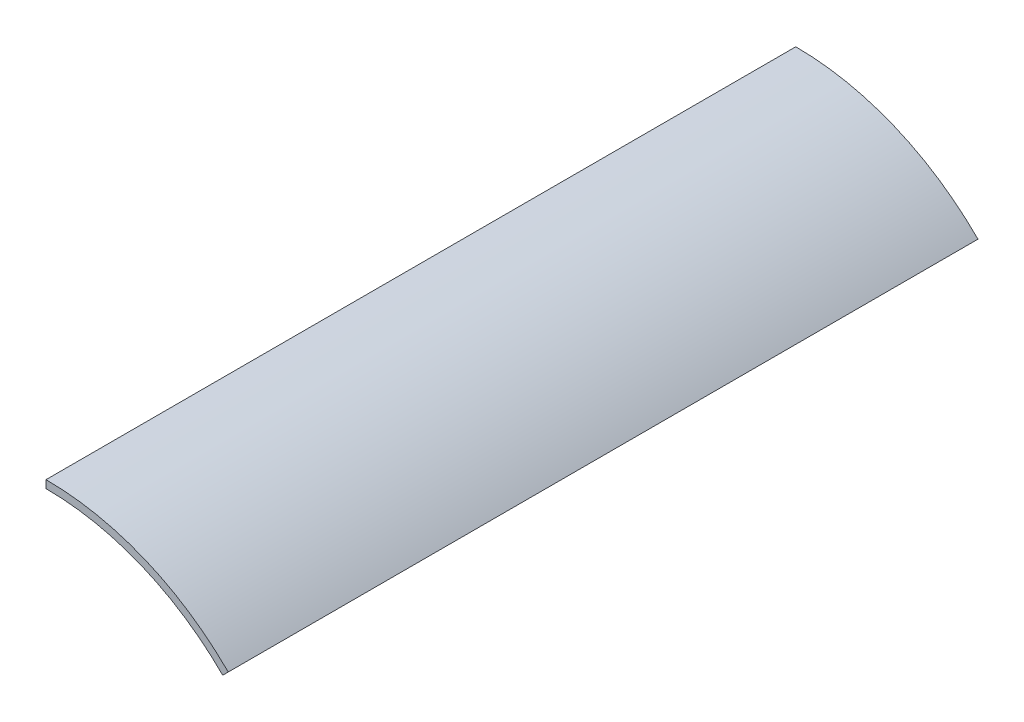
ISO-10303-21;
HEADER;
FILE_DESCRIPTION(('STEP AP214'),'2;1');
FILE_NAME('part.step','',(''),(''),'','','');
FILE_SCHEMA(('AUTOMOTIVE_DESIGN { 1 0 10303 214 1 1 1 1 }'));
ENDSEC;
DATA;
#1=APPLICATION_CONTEXT('core data for automotive mechanical design processes');
#2=APPLICATION_PROTOCOL_DEFINITION('international standard','automotive_design',2000,#1);
#3=PRODUCT_CONTEXT('',#1,'mechanical');
#4=PRODUCT('Part','Part','',(#3));
#5=PRODUCT_RELATED_PRODUCT_CATEGORY('part','',(#4));
#6=PRODUCT_DEFINITION_FORMATION('','',#4);
#7=PRODUCT_DEFINITION_CONTEXT('part definition',#1,'design');
#8=PRODUCT_DEFINITION('design','',#6,#7);
#9=PRODUCT_DEFINITION_SHAPE('','',#8);
#10=(LENGTH_UNIT() NAMED_UNIT(*) SI_UNIT(.MILLI.,.METRE.));
#11=(NAMED_UNIT(*) PLANE_ANGLE_UNIT() SI_UNIT($,.RADIAN.));
#12=(NAMED_UNIT(*) SI_UNIT($,.STERADIAN.) SOLID_ANGLE_UNIT());
#13=UNCERTAINTY_MEASURE_WITH_UNIT(LENGTH_MEASURE(1.E-05),#10,'distance_accuracy_value','');
#14=(GEOMETRIC_REPRESENTATION_CONTEXT(3) GLOBAL_UNCERTAINTY_ASSIGNED_CONTEXT((#13)) GLOBAL_UNIT_ASSIGNED_CONTEXT((#10,
#11,#12)) REPRESENTATION_CONTEXT('',''));
#15=CARTESIAN_POINT('',(0.,0.,0.));
#16=DIRECTION('',(0.,0.,1.));
#17=DIRECTION('',(1.,0.,0.));
#18=AXIS2_PLACEMENT_3D('',#15,#16,#17);
#19=CARTESIAN_POINT('',(0.,0.,-152.4));
#20=DIRECTION('',(0.,0.,1.));
#21=DIRECTION('',(1.,0.,0.));
#22=AXIS2_PLACEMENT_3D('',#19,#20,#21);
#23=CYLINDRICAL_SURFACE('',#22,101.6);
#24=DIRECTION('',(0.,0.,1.));
#25=VECTOR('',#24,1.);
#26=CARTESIAN_POINT('',(71.8420489685534,71.8420489685531,-152.4));
#27=LINE('',#26,#25);
#28=CARTESIAN_POINT('',(71.8420489685534,71.8420489685531,-152.4));
#29=VERTEX_POINT('',#28);
#30=CARTESIAN_POINT('',(71.8420489685534,71.8420489685531,152.4));
#31=VERTEX_POINT('',#30);
#32=EDGE_CURVE('E36',#29,#31,#27,.T.);
#33=ORIENTED_EDGE('',*,*,#32,.T.);
#34=CARTESIAN_POINT('',(0.,0.,152.4));
#35=DIRECTION('',(0.,0.,-1.));
#36=DIRECTION('',(-1.,0.,0.));
#37=AXIS2_PLACEMENT_3D('',#34,#35,#36);
#38=CIRCLE('',#37,101.6);
#39=CARTESIAN_POINT('',(0.,101.6,152.4));
#40=VERTEX_POINT('',#39);
#41=EDGE_CURVE('E73',#40,#31,#38,.T.);
#42=ORIENTED_EDGE('',*,*,#41,.F.);
#43=DIRECTION('',(0.,0.,1.));
#44=VECTOR('',#43,1.);
#45=CARTESIAN_POINT('',(0.,101.6,-152.4));
#46=LINE('',#45,#44);
#47=CARTESIAN_POINT('',(0.,101.6,-152.4));
#48=VERTEX_POINT('',#47);
#49=EDGE_CURVE('E11',#48,#40,#46,.T.);
#50=ORIENTED_EDGE('',*,*,#49,.F.);
#51=CARTESIAN_POINT('',(0.,0.,-152.4));
#52=DIRECTION('',(0.,0.,-1.));
#53=DIRECTION('',(-1.,0.,0.));
#54=AXIS2_PLACEMENT_3D('',#51,#52,#53);
#55=CIRCLE('',#54,101.6);
#56=EDGE_CURVE('E74',#48,#29,#55,.T.);
#57=ORIENTED_EDGE('',*,*,#56,.T.);
#58=EDGE_LOOP('',(#33,#42,#50,#57));
#59=FACE_BOUND('',#58,.T.);
#60=ADVANCED_FACE('F33',(#59),#23,.F.);
#61=CARTESIAN_POINT('',(0.,104.775,-152.4));
#62=DIRECTION('',(-1.,0.,0.));
#63=DIRECTION('',(0.,-1.,0.));
#64=AXIS2_PLACEMENT_3D('',#61,#62,#63);
#65=PLANE('',#64);
#66=ORIENTED_EDGE('',*,*,#49,.T.);
#67=DIRECTION('',(0.,-1.,0.));
#68=VECTOR('',#67,1.);
#69=CARTESIAN_POINT('',(0.,104.775,152.4));
#70=LINE('',#69,#68);
#71=CARTESIAN_POINT('',(0.,104.775,152.4));
#72=VERTEX_POINT('',#71);
#73=EDGE_CURVE('E90',#72,#40,#70,.T.);
#74=ORIENTED_EDGE('',*,*,#73,.F.);
#75=DIRECTION('',(0.,0.,1.));
#76=VECTOR('',#75,1.);
#77=CARTESIAN_POINT('',(0.,104.775,-152.4));
#78=LINE('',#77,#76);
#79=CARTESIAN_POINT('',(0.,104.775,-152.4));
#80=VERTEX_POINT('',#79);
#81=EDGE_CURVE('E41',#80,#72,#78,.T.);
#82=ORIENTED_EDGE('',*,*,#81,.F.);
#83=DIRECTION('',(0.,-1.,0.));
#84=VECTOR('',#83,1.);
#85=CARTESIAN_POINT('',(0.,104.775,-152.4));
#86=LINE('',#85,#84);
#87=EDGE_CURVE('E79',#80,#48,#86,.T.);
#88=ORIENTED_EDGE('',*,*,#87,.T.);
#89=EDGE_LOOP('',(#66,#74,#82,#88));
#90=FACE_BOUND('',#89,.T.);
#91=ADVANCED_FACE('F105',(#90),#65,.T.);
#92=CARTESIAN_POINT('',(0.,0.,-152.4));
#93=DIRECTION('',(0.,0.,1.));
#94=DIRECTION('',(1.,0.,0.));
#95=AXIS2_PLACEMENT_3D('',#92,#93,#94);
#96=CYLINDRICAL_SURFACE('',#95,104.775);
#97=ORIENTED_EDGE('',*,*,#81,.T.);
#98=CARTESIAN_POINT('',(0.,0.,152.4));
#99=DIRECTION('',(0.,0.,1.));
#100=DIRECTION('',(-1.,0.,0.));
#101=AXIS2_PLACEMENT_3D('',#98,#99,#100);
#102=CIRCLE('',#101,104.775);
#103=CARTESIAN_POINT('',(74.0871129988206,74.0871129988204,152.4));
#104=VERTEX_POINT('',#103);
#105=EDGE_CURVE('E86',#104,#72,#102,.T.);
#106=ORIENTED_EDGE('',*,*,#105,.F.);
#107=DIRECTION('',(0.,0.,1.));
#108=VECTOR('',#107,1.);
#109=CARTESIAN_POINT('',(74.0871129988206,74.0871129988204,-152.4));
#110=LINE('',#109,#108);
#111=CARTESIAN_POINT('',(74.0871129988206,74.0871129988204,-152.4));
#112=VERTEX_POINT('',#111);
#113=EDGE_CURVE('E78',#112,#104,#110,.T.);
#114=ORIENTED_EDGE('',*,*,#113,.F.);
#115=CARTESIAN_POINT('',(0.,0.,-152.4));
#116=DIRECTION('',(0.,0.,1.));
#117=DIRECTION('',(-1.,0.,0.));
#118=AXIS2_PLACEMENT_3D('',#115,#116,#117);
#119=CIRCLE('',#118,104.775);
#120=EDGE_CURVE('E98',#112,#80,#119,.T.);
#121=ORIENTED_EDGE('',*,*,#120,.T.);
#122=EDGE_LOOP('',(#97,#106,#114,#121));
#123=FACE_BOUND('',#122,.T.);
#124=ADVANCED_FACE('F102',(#123),#96,.T.);
#125=CARTESIAN_POINT('',(74.0871129988206,74.0871129988204,-152.4));
#126=DIRECTION('',(0.707106781186554,-0.707106781186541,0.));
#127=DIRECTION('',(0.707106781186541,0.707106781186554,0.));
#128=AXIS2_PLACEMENT_3D('',#125,#126,#127);
#129=PLANE('',#128);
#130=ORIENTED_EDGE('',*,*,#113,.T.);
#131=DIRECTION('',(0.707106781186541,0.707106781186554,0.));
#132=VECTOR('',#131,1.);
#133=CARTESIAN_POINT('',(74.0871129988206,74.0871129988204,152.4));
#134=LINE('',#133,#132);
#135=EDGE_CURVE('E81',#31,#104,#134,.T.);
#136=ORIENTED_EDGE('',*,*,#135,.F.);
#137=ORIENTED_EDGE('',*,*,#32,.F.);
#138=DIRECTION('',(0.707106781186541,0.707106781186554,0.));
#139=VECTOR('',#138,1.);
#140=CARTESIAN_POINT('',(74.0871129988206,74.0871129988204,-152.4));
#141=LINE('',#140,#139);
#142=EDGE_CURVE('E96',#29,#112,#141,.T.);
#143=ORIENTED_EDGE('',*,*,#142,.T.);
#144=EDGE_LOOP('',(#130,#136,#137,#143));
#145=FACE_BOUND('',#144,.T.);
#146=ADVANCED_FACE('F82',(#145),#129,.T.);
#147=CARTESIAN_POINT('',(0.,0.,-152.4));
#148=DIRECTION('',(0.,0.,-1.));
#149=DIRECTION('',(-1.,0.,0.));
#150=AXIS2_PLACEMENT_3D('',#147,#148,#149);
#151=PLANE('',#150);
#152=ORIENTED_EDGE('',*,*,#56,.F.);
#153=ORIENTED_EDGE('',*,*,#87,.F.);
#154=ORIENTED_EDGE('',*,*,#120,.F.);
#155=ORIENTED_EDGE('',*,*,#142,.F.);
#156=EDGE_LOOP('',(#152,#153,#154,#155));
#157=FACE_BOUND('',#156,.T.);
#158=ADVANCED_FACE('F107',(#157),#151,.T.);
#159=CARTESIAN_POINT('',(0.,0.,152.4));
#160=DIRECTION('',(0.,0.,-1.));
#161=DIRECTION('',(-1.,0.,0.));
#162=AXIS2_PLACEMENT_3D('',#159,#160,#161);
#163=PLANE('',#162);
#164=ORIENTED_EDGE('',*,*,#41,.T.);
#165=ORIENTED_EDGE('',*,*,#135,.T.);
#166=ORIENTED_EDGE('',*,*,#105,.T.);
#167=ORIENTED_EDGE('',*,*,#73,.T.);
#168=EDGE_LOOP('',(#164,#165,#166,#167));
#169=FACE_BOUND('',#168,.T.);
#170=ADVANCED_FACE('F89',(#169),#163,.F.);
#171=CLOSED_SHELL('',(#60,#91,#124,#146,#158,#170));
#172=MANIFOLD_SOLID_BREP('B2',#171);
#173=ADVANCED_BREP_SHAPE_REPRESENTATION('',(#18,#172),#14);
#174=SHAPE_DEFINITION_REPRESENTATION(#9,#173);
ENDSEC;
END-ISO-10303-21;
